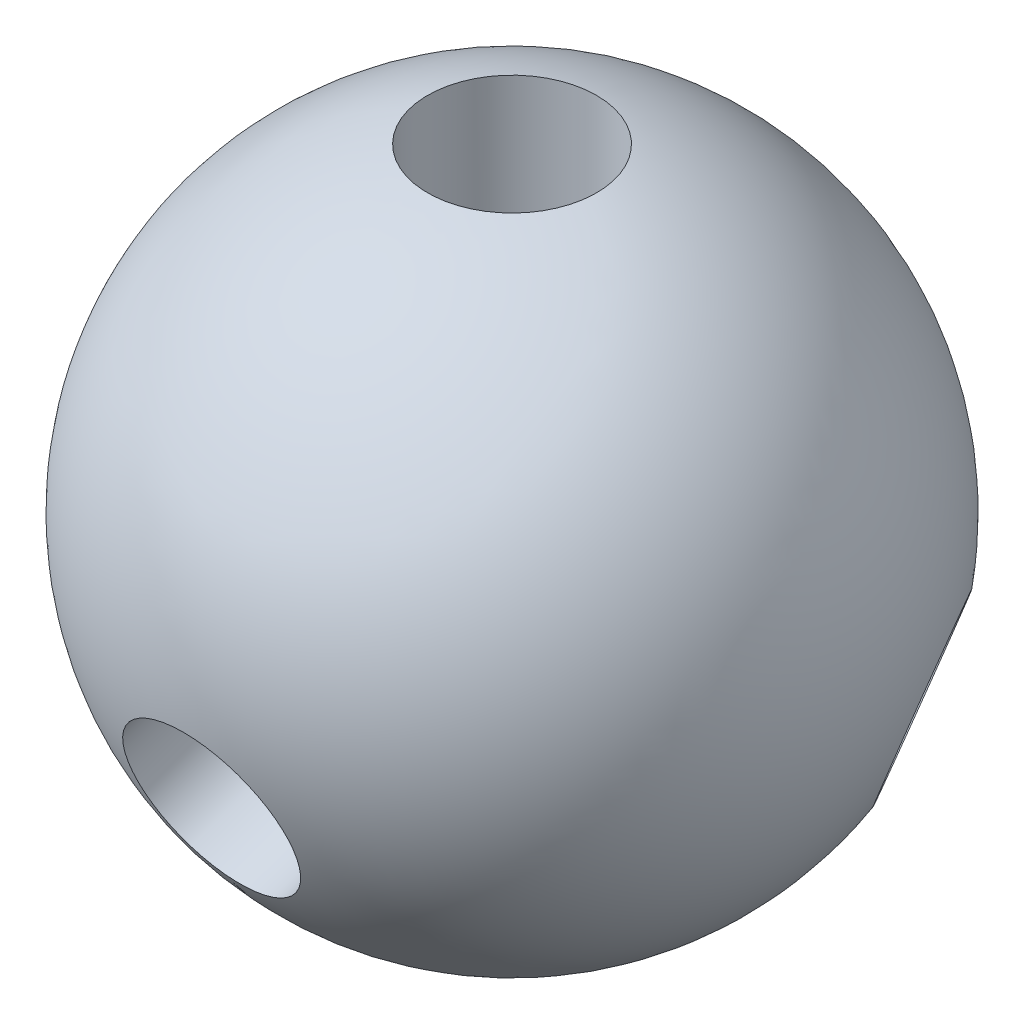
ISO-10303-21;
HEADER;
FILE_DESCRIPTION(('STEP AP214'),'2;1');
FILE_NAME('part.step','',(''),(''),'','','');
FILE_SCHEMA(('AUTOMOTIVE_DESIGN { 1 0 10303 214 1 1 1 1 }'));
ENDSEC;
DATA;
#1=APPLICATION_CONTEXT('core data for automotive mechanical design processes');
#2=APPLICATION_PROTOCOL_DEFINITION('international standard','automotive_design',2000,#1);
#3=PRODUCT_CONTEXT('',#1,'mechanical');
#4=PRODUCT('Part','Part','',(#3));
#5=PRODUCT_RELATED_PRODUCT_CATEGORY('part','',(#4));
#6=PRODUCT_DEFINITION_FORMATION('','',#4);
#7=PRODUCT_DEFINITION_CONTEXT('part definition',#1,'design');
#8=PRODUCT_DEFINITION('design','',#6,#7);
#9=PRODUCT_DEFINITION_SHAPE('','',#8);
#10=(LENGTH_UNIT() NAMED_UNIT(*) SI_UNIT(.MILLI.,.METRE.));
#11=(NAMED_UNIT(*) PLANE_ANGLE_UNIT() SI_UNIT($,.RADIAN.));
#12=(NAMED_UNIT(*) SI_UNIT($,.STERADIAN.) SOLID_ANGLE_UNIT());
#13=UNCERTAINTY_MEASURE_WITH_UNIT(LENGTH_MEASURE(1.E-05),#10,'distance_accuracy_value','');
#14=(GEOMETRIC_REPRESENTATION_CONTEXT(3) GLOBAL_UNCERTAINTY_ASSIGNED_CONTEXT((#13)) GLOBAL_UNIT_ASSIGNED_CONTEXT((#10,
#11,#12)) REPRESENTATION_CONTEXT('',''));
#15=CARTESIAN_POINT('',(0.,0.,0.));
#16=DIRECTION('',(0.,0.,1.));
#17=DIRECTION('',(1.,0.,0.));
#18=AXIS2_PLACEMENT_3D('',#15,#16,#17);
#19=CARTESIAN_POINT('',(0.,-3.33333333333337,9.42809041582062));
#20=DIRECTION('',(0.,0.333333333333337,-0.942809041582062));
#21=DIRECTION('',(0.,0.942809041582062,0.333333333333337));
#22=AXIS2_PLACEMENT_3D('',#19,#20,#21);
#23=CYLINDRICAL_SURFACE('',#22,2.55);
#24=CARTESIAN_POINT('',(0.,-1.66666666666669,4.71404520791031));
#25=DIRECTION('',(0.,-0.333333333333337,0.942809041582062));
#26=DIRECTION('',(0.,-0.942809041582062,-0.333333333333337));
#27=AXIS2_PLACEMENT_3D('',#24,#25,#26);
#28=CIRCLE('',#27,2.55);
#29=CARTESIAN_POINT('',(0.,-4.07082972270095,3.8640452079103));
#30=VERTEX_POINT('',#29);
#31=EDGE_CURVE('E43',#30,#30,#28,.T.);
#32=ORIENTED_EDGE('',*,*,#31,.F.);
#33=EDGE_LOOP('',(#32));
#34=FACE_BOUND('',#33,.T.);
#35=CARTESIAN_POINT('',(0.,-3.20589734361193,9.06764700582362));
#36=DIRECTION('',(0.,0.333333333333337,-0.942809041582062));
#37=DIRECTION('',(0.,0.942809041582062,0.333333333333337));
#38=AXIS2_PLACEMENT_3D('',#35,#36,#37);
#39=CIRCLE('',#38,2.55);
#40=CARTESIAN_POINT('',(0.,-0.801734287577673,9.91764700582363));
#41=VERTEX_POINT('',#40);
#42=EDGE_CURVE('E62',#41,#41,#39,.F.);
#43=ORIENTED_EDGE('',*,*,#42,.T.);
#44=EDGE_LOOP('',(#43));
#45=FACE_BOUND('',#44,.T.);
#46=ADVANCED_FACE('F40',(#34,#45),#23,.F.);
#47=CARTESIAN_POINT('',(0.,-1.66666666666669,4.71404520791031));
#48=DIRECTION('',(0.,-0.333333333333337,0.942809041582062));
#49=DIRECTION('',(0.,-0.942809041582062,-0.333333333333337));
#50=AXIS2_PLACEMENT_3D('',#47,#48,#49);
#51=PLANE('',#50);
#52=ORIENTED_EDGE('',*,*,#31,.T.);
#53=EDGE_LOOP('',(#52));
#54=FACE_BOUND('',#53,.T.);
#55=ADVANCED_FACE('F75',(#54),#51,.T.);
#56=CARTESIAN_POINT('',(0.,0.,0.));
#57=DIRECTION('',(-1.,0.,0.));
#58=DIRECTION('',(0.,1.,0.));
#59=AXIS2_PLACEMENT_3D('',#56,#57,#58);
#60=SPHERICAL_SURFACE('',#59,9.95);
#61=ORIENTED_EDGE('',*,*,#42,.F.);
#62=EDGE_LOOP('',(#61));
#63=FACE_BOUND('',#62,.T.);
#64=CARTESIAN_POINT('',(-7.85281265959313,-3.20589734361193,-4.53382350291184));
#65=DIRECTION('',(0.816496580927723,0.333333333333337,0.471404520791035));
#66=DIRECTION('',(0.500000000000004,0.,-0.866025403784436));
#67=AXIS2_PLACEMENT_3D('',#64,#65,#66);
#68=CIRCLE('',#67,2.55);
#69=CARTESIAN_POINT('',(-6.57781265959312,-3.20589734361193,-6.74218828256216));
#70=VERTEX_POINT('',#69);
#71=EDGE_CURVE('E54',#70,#70,#68,.F.);
#72=ORIENTED_EDGE('',*,*,#71,.F.);
#73=EDGE_LOOP('',(#72));
#74=FACE_BOUND('',#73,.T.);
#75=CARTESIAN_POINT('',(7.8528126595932,-3.20589734361193,-4.53382350291174));
#76=DIRECTION('',(-0.816496580927729,0.333333333333337,0.471404520791023));
#77=DIRECTION('',(0.499999999999992,0.,0.866025403784443));
#78=AXIS2_PLACEMENT_3D('',#75,#76,#77);
#79=CIRCLE('',#78,2.55);
#80=CARTESIAN_POINT('',(9.12781265959317,-3.20589734361193,-2.32545872326141));
#81=VERTEX_POINT('',#80);
#82=EDGE_CURVE('E48',#81,#81,#79,.F.);
#83=ORIENTED_EDGE('',*,*,#82,.F.);
#84=EDGE_LOOP('',(#83));
#85=FACE_BOUND('',#84,.T.);
#86=CARTESIAN_POINT('',(0.,9.61769203083567,0.));
#87=DIRECTION('',(0.,-1.,0.));
#88=DIRECTION('',(0.,0.,-1.));
#89=AXIS2_PLACEMENT_3D('',#86,#87,#88);
#90=CIRCLE('',#89,2.55);
#91=CARTESIAN_POINT('',(0.,9.61769203083567,-2.55));
#92=VERTEX_POINT('',#91);
#93=EDGE_CURVE('E11',#92,#92,#90,.F.);
#94=ORIENTED_EDGE('',*,*,#93,.F.);
#95=EDGE_LOOP('',(#94));
#96=FACE_BOUND('',#95,.T.);
#97=ADVANCED_FACE('F90',(#63,#74,#85,#96),#60,.T.);
#98=CARTESIAN_POINT('',(-8.16496580927723,-3.33333333333337,-4.71404520791035));
#99=DIRECTION('',(0.816496580927723,0.333333333333337,0.471404520791035));
#100=DIRECTION('',(-0.288675134594816,0.942809041582062,-0.16666666666667));
#101=AXIS2_PLACEMENT_3D('',#98,#99,#100);
#102=CYLINDRICAL_SURFACE('',#101,2.55);
#103=CARTESIAN_POINT('',(-4.08248290463861,-1.66666666666669,-2.35702260395517));
#104=DIRECTION('',(-0.816496580927723,-0.333333333333337,-0.471404520791035));
#105=DIRECTION('',(-0.500000000000004,0.,0.866025403784436));
#106=AXIS2_PLACEMENT_3D('',#103,#104,#105);
#107=CIRCLE('',#106,2.55);
#108=CARTESIAN_POINT('',(-5.35748290463862,-1.66666666666669,-0.148657824304861));
#109=VERTEX_POINT('',#108);
#110=EDGE_CURVE('E66',#109,#109,#107,.T.);
#111=ORIENTED_EDGE('',*,*,#110,.F.);
#112=EDGE_LOOP('',(#111));
#113=FACE_BOUND('',#112,.T.);
#114=ORIENTED_EDGE('',*,*,#71,.T.);
#115=EDGE_LOOP('',(#114));
#116=FACE_BOUND('',#115,.T.);
#117=ADVANCED_FACE('F88',(#113,#116),#102,.F.);
#118=CARTESIAN_POINT('',(-4.08248290463861,-1.66666666666669,-2.35702260395517));
#119=DIRECTION('',(-0.816496580927723,-0.333333333333337,-0.471404520791035));
#120=DIRECTION('',(0.288675134594816,-0.942809041582062,0.16666666666667));
#121=AXIS2_PLACEMENT_3D('',#118,#119,#120);
#122=PLANE('',#121);
#123=ORIENTED_EDGE('',*,*,#110,.T.);
#124=EDGE_LOOP('',(#123));
#125=FACE_BOUND('',#124,.T.);
#126=ADVANCED_FACE('F100',(#125),#122,.T.);
#127=CARTESIAN_POINT('',(8.16496580927729,-3.33333333333337,-4.71404520791023));
#128=DIRECTION('',(-0.816496580927729,0.333333333333337,0.471404520791023));
#129=DIRECTION('',(0.288675134594818,0.942809041582062,-0.166666666666666));
#130=AXIS2_PLACEMENT_3D('',#127,#128,#129);
#131=CYLINDRICAL_SURFACE('',#130,2.55);
#132=CARTESIAN_POINT('',(4.08248290463865,-1.66666666666669,-2.35702260395512));
#133=DIRECTION('',(0.816496580927729,-0.333333333333337,-0.471404520791023));
#134=DIRECTION('',(-0.499999999999992,0.,-0.866025403784443));
#135=AXIS2_PLACEMENT_3D('',#132,#133,#134);
#136=CIRCLE('',#135,2.55);
#137=CARTESIAN_POINT('',(2.80748290463867,-1.66666666666669,-4.56538738360545));
#138=VERTEX_POINT('',#137);
#139=EDGE_CURVE('E63',#138,#138,#136,.T.);
#140=ORIENTED_EDGE('',*,*,#139,.F.);
#141=EDGE_LOOP('',(#140));
#142=FACE_BOUND('',#141,.T.);
#143=ORIENTED_EDGE('',*,*,#82,.T.);
#144=EDGE_LOOP('',(#143));
#145=FACE_BOUND('',#144,.T.);
#146=ADVANCED_FACE('F97',(#142,#145),#131,.F.);
#147=CARTESIAN_POINT('',(4.08248290463865,-1.66666666666669,-2.35702260395512));
#148=DIRECTION('',(0.816496580927729,-0.333333333333337,-0.471404520791023));
#149=DIRECTION('',(-0.288675134594818,-0.942809041582062,0.166666666666666));
#150=AXIS2_PLACEMENT_3D('',#147,#148,#149);
#151=PLANE('',#150);
#152=ORIENTED_EDGE('',*,*,#139,.T.);
#153=EDGE_LOOP('',(#152));
#154=FACE_BOUND('',#153,.T.);
#155=ADVANCED_FACE('F99',(#154),#151,.T.);
#156=CARTESIAN_POINT('',(0.,10.,0.));
#157=DIRECTION('',(0.,-1.,0.));
#158=DIRECTION('',(0.,0.,-1.));
#159=AXIS2_PLACEMENT_3D('',#156,#157,#158);
#160=CYLINDRICAL_SURFACE('',#159,2.55);
#161=CARTESIAN_POINT('',(0.,5.,0.));
#162=DIRECTION('',(0.,1.,0.));
#163=DIRECTION('',(0.,0.,1.));
#164=AXIS2_PLACEMENT_3D('',#161,#162,#163);
#165=CIRCLE('',#164,2.55);
#166=CARTESIAN_POINT('',(0.,5.,2.55));
#167=VERTEX_POINT('',#166);
#168=EDGE_CURVE('E58',#167,#167,#165,.T.);
#169=ORIENTED_EDGE('',*,*,#168,.F.);
#170=EDGE_LOOP('',(#169));
#171=FACE_BOUND('',#170,.T.);
#172=ORIENTED_EDGE('',*,*,#93,.T.);
#173=EDGE_LOOP('',(#172));
#174=FACE_BOUND('',#173,.T.);
#175=ADVANCED_FACE('F107',(#171,#174),#160,.F.);
#176=CARTESIAN_POINT('',(0.,5.,0.));
#177=DIRECTION('',(0.,1.,0.));
#178=DIRECTION('',(0.,0.,1.));
#179=AXIS2_PLACEMENT_3D('',#176,#177,#178);
#180=PLANE('',#179);
#181=ORIENTED_EDGE('',*,*,#168,.T.);
#182=EDGE_LOOP('',(#181));
#183=FACE_BOUND('',#182,.T.);
#184=ADVANCED_FACE('F140',(#183),#180,.T.);
#185=CLOSED_SHELL('',(#46,#55,#97,#117,#126,#146,#155,#175,#184));
#186=MANIFOLD_SOLID_BREP('B2',#185);
#187=ADVANCED_BREP_SHAPE_REPRESENTATION('',(#18,#186),#14);
#188=SHAPE_DEFINITION_REPRESENTATION(#9,#187);
ENDSEC;
END-ISO-10303-21;
